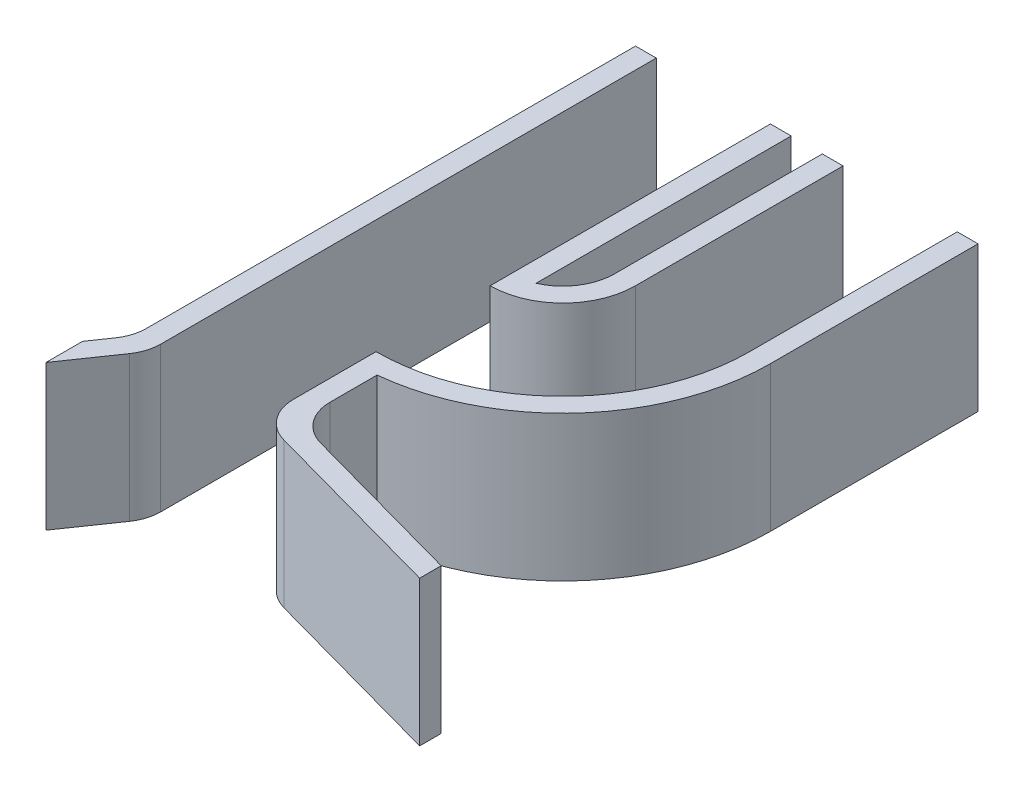
ISO-10303-21;
HEADER;
FILE_DESCRIPTION(('STEP AP214'),'2;1');
FILE_NAME('part.step','',(''),(''),'','','');
FILE_SCHEMA(('AUTOMOTIVE_DESIGN { 1 0 10303 214 1 1 1 1 }'));
ENDSEC;
DATA;
#1=APPLICATION_CONTEXT('core data for automotive mechanical design processes');
#2=APPLICATION_PROTOCOL_DEFINITION('international standard','automotive_design',2000,#1);
#3=PRODUCT_CONTEXT('',#1,'mechanical');
#4=PRODUCT('Part','Part','',(#3));
#5=PRODUCT_RELATED_PRODUCT_CATEGORY('part','',(#4));
#6=PRODUCT_DEFINITION_FORMATION('','',#4);
#7=PRODUCT_DEFINITION_CONTEXT('part definition',#1,'design');
#8=PRODUCT_DEFINITION('design','',#6,#7);
#9=PRODUCT_DEFINITION_SHAPE('','',#8);
#10=(LENGTH_UNIT() NAMED_UNIT(*) SI_UNIT(.MILLI.,.METRE.));
#11=(NAMED_UNIT(*) PLANE_ANGLE_UNIT() SI_UNIT($,.RADIAN.));
#12=(NAMED_UNIT(*) SI_UNIT($,.STERADIAN.) SOLID_ANGLE_UNIT());
#13=UNCERTAINTY_MEASURE_WITH_UNIT(LENGTH_MEASURE(1.E-05),#10,'distance_accuracy_value','');
#14=(GEOMETRIC_REPRESENTATION_CONTEXT(3) GLOBAL_UNCERTAINTY_ASSIGNED_CONTEXT((#13)) GLOBAL_UNIT_ASSIGNED_CONTEXT((#10,
#11,#12)) REPRESENTATION_CONTEXT('',''));
#15=CARTESIAN_POINT('',(0.,0.,0.));
#16=DIRECTION('',(0.,0.,1.));
#17=DIRECTION('',(1.,0.,0.));
#18=AXIS2_PLACEMENT_3D('',#15,#16,#17);
#19=CARTESIAN_POINT('',(0.,0.,0.));
#20=DIRECTION('',(0.,1.,0.));
#21=DIRECTION('',(0.,0.,1.));
#22=AXIS2_PLACEMENT_3D('',#19,#20,#21);
#23=PLANE('',#22);
#24=DIRECTION('',(-0.963911423189183,0.,-0.266223154976055));
#25=VECTOR('',#24,1.);
#26=CARTESIAN_POINT('',(1.94905612674862,0.,-7.05692735546926));
#27=LINE('',#26,#25);
#28=CARTESIAN_POINT('',(132.500000000002,0.,29.0000000000001));
#29=VERTEX_POINT('',#28);
#30=CARTESIAN_POINT('',(42.1755369004788,0.,4.05324352489411));
#31=VERTEX_POINT('',#30);
#32=EDGE_CURVE('E431',#29,#31,#27,.T.);
#33=ORIENTED_EDGE('',*,*,#32,.T.);
#34=CARTESIAN_POINT('',(47.4999999999999,0.,-15.2249849388895));
#35=DIRECTION('',(0.,1.,0.));
#36=DIRECTION('',(0.,0.,1.));
#37=AXIS2_PLACEMENT_3D('',#34,#35,#36);
#38=CIRCLE('',#37,20.);
#39=CARTESIAN_POINT('',(27.4999999999999,0.,-15.2249849388895));
#40=VERTEX_POINT('',#39);
#41=EDGE_CURVE('E322',#31,#40,#38,.F.);
#42=ORIENTED_EDGE('',*,*,#41,.T.);
#43=DIRECTION('',(0.,0.,-1.));
#44=VECTOR('',#43,1.);
#45=CARTESIAN_POINT('',(27.4999999999999,0.,0.));
#46=LINE('',#45,#44);
#47=CARTESIAN_POINT('',(27.4999999999999,0.,-55.));
#48=VERTEX_POINT('',#47);
#49=EDGE_CURVE('E391',#40,#48,#46,.T.);
#50=ORIENTED_EDGE('',*,*,#49,.T.);
#51=CARTESIAN_POINT('',(27.4999999999999,0.,-145.));
#52=DIRECTION('',(0.,1.,0.));
#53=DIRECTION('',(0.,0.,1.));
#54=AXIS2_PLACEMENT_3D('',#51,#52,#53);
#55=CIRCLE('',#54,89.9999999999999);
#56=CARTESIAN_POINT('',(117.5,0.,-145.));
#57=VERTEX_POINT('',#56);
#58=EDGE_CURVE('E386',#48,#57,#55,.T.);
#59=ORIENTED_EDGE('',*,*,#58,.T.);
#60=DIRECTION('',(0.,0.,-1.));
#61=VECTOR('',#60,1.);
#62=CARTESIAN_POINT('',(117.5,0.,0.));
#63=LINE('',#62,#61);
#64=CARTESIAN_POINT('',(117.5,0.,-245.));
#65=VERTEX_POINT('',#64);
#66=EDGE_CURVE('E390',#57,#65,#63,.T.);
#67=ORIENTED_EDGE('',*,*,#66,.T.);
#68=DIRECTION('',(-1.,0.,0.));
#69=VECTOR('',#68,1.);
#70=CARTESIAN_POINT('',(0.,0.,-245.));
#71=LINE('',#70,#69);
#72=CARTESIAN_POINT('',(127.5,0.,-245.));
#73=VERTEX_POINT('',#72);
#74=EDGE_CURVE('E411',#73,#65,#71,.T.);
#75=ORIENTED_EDGE('',*,*,#74,.F.);
#76=DIRECTION('',(0.,0.,-1.));
#77=VECTOR('',#76,1.);
#78=CARTESIAN_POINT('',(127.5,0.,0.));
#79=LINE('',#78,#77);
#80=CARTESIAN_POINT('',(127.5,0.,-145.));
#81=VERTEX_POINT('',#80);
#82=EDGE_CURVE('E414',#81,#73,#79,.T.);
#83=ORIENTED_EDGE('',*,*,#82,.F.);
#84=CARTESIAN_POINT('',(27.4999999999999,0.,-145.));
#85=DIRECTION('',(0.,1.,0.));
#86=DIRECTION('',(0.,0.,1.));
#87=AXIS2_PLACEMENT_3D('',#84,#85,#86);
#88=CIRCLE('',#87,99.9999999999999);
#89=CARTESIAN_POINT('',(37.4999999999999,0.,-45.501256289338));
#90=VERTEX_POINT('',#89);
#91=EDGE_CURVE('E421',#90,#81,#88,.T.);
#92=ORIENTED_EDGE('',*,*,#91,.F.);
#93=DIRECTION('',(0.,0.,1.));
#94=VECTOR('',#93,1.);
#95=CARTESIAN_POINT('',(37.4999999999999,0.,0.));
#96=LINE('',#95,#94);
#97=CARTESIAN_POINT('',(37.4999999999999,0.,-22.8374774083343));
#98=VERTEX_POINT('',#97);
#99=EDGE_CURVE('E423',#90,#98,#96,.T.);
#100=ORIENTED_EDGE('',*,*,#99,.T.);
#101=CARTESIAN_POINT('',(57.4999999999999,0.,-22.8374774083343));
#102=DIRECTION('',(0.,1.,0.));
#103=DIRECTION('',(0.,0.,1.));
#104=AXIS2_PLACEMENT_3D('',#101,#102,#103);
#105=CIRCLE('',#104,20.);
#106=CARTESIAN_POINT('',(52.1755369004788,0.,-3.55924894455067));
#107=VERTEX_POINT('',#106);
#108=EDGE_CURVE('E307',#98,#107,#105,.T.);
#109=ORIENTED_EDGE('',*,*,#108,.T.);
#110=DIRECTION('',(0.963911423189183,0.,0.266223154976055));
#111=VECTOR('',#110,1.);
#112=CARTESIAN_POINT('',(4.61128767650917,0.,-16.6960415873611));
#113=LINE('',#112,#111);
#114=CARTESIAN_POINT('',(132.500000000002,0.,18.6256027686506));
#115=VERTEX_POINT('',#114);
#116=EDGE_CURVE('E426',#107,#115,#113,.T.);
#117=ORIENTED_EDGE('',*,*,#116,.T.);
#118=DIRECTION('',(0.,0.,1.));
#119=VECTOR('',#118,1.);
#120=CARTESIAN_POINT('',(132.500000000002,0.,0.));
#121=LINE('',#120,#119);
#122=EDGE_CURVE('E428',#115,#29,#121,.T.);
#123=ORIENTED_EDGE('',*,*,#122,.T.);
#124=EDGE_LOOP('',(#33,#42,#50,#59,#67,#75,#83,#92,#100,#109,#117,#123));
#125=FACE_BOUND('',#124,.T.);
#126=ADVANCED_FACE('F299',(#125),#23,.F.);
#127=CARTESIAN_POINT('',(27.4999999999999,70.,-145.));
#128=DIRECTION('',(0.,-1.,0.));
#129=DIRECTION('',(0.,0.,-1.));
#130=AXIS2_PLACEMENT_3D('',#127,#128,#129);
#131=CYLINDRICAL_SURFACE('',#130,89.9999999999999);
#132=DIRECTION('',(0.,-1.,0.));
#133=VECTOR('',#132,1.);
#134=CARTESIAN_POINT('',(117.5,70.,-145.));
#135=LINE('',#134,#133);
#136=CARTESIAN_POINT('',(117.5,70.,-145.));
#137=VERTEX_POINT('',#136);
#138=EDGE_CURVE('E399',#137,#57,#135,.T.);
#139=ORIENTED_EDGE('',*,*,#138,.T.);
#140=ORIENTED_EDGE('',*,*,#58,.F.);
#141=DIRECTION('',(0.,-1.,0.));
#142=VECTOR('',#141,1.);
#143=CARTESIAN_POINT('',(27.4999999999999,70.,-55.));
#144=LINE('',#143,#142);
#145=CARTESIAN_POINT('',(27.4999999999999,70.,-55.));
#146=VERTEX_POINT('',#145);
#147=EDGE_CURVE('E504',#146,#48,#144,.T.);
#148=ORIENTED_EDGE('',*,*,#147,.F.);
#149=CARTESIAN_POINT('',(27.4999999999999,70.,-145.));
#150=DIRECTION('',(0.,1.,0.));
#151=DIRECTION('',(0.,0.,1.));
#152=AXIS2_PLACEMENT_3D('',#149,#150,#151);
#153=CIRCLE('',#152,89.9999999999999);
#154=EDGE_CURVE('E396',#146,#137,#153,.T.);
#155=ORIENTED_EDGE('',*,*,#154,.T.);
#156=EDGE_LOOP('',(#139,#140,#148,#155));
#157=FACE_BOUND('',#156,.T.);
#158=ADVANCED_FACE('F400',(#157),#131,.F.);
#159=CARTESIAN_POINT('',(27.4999999999999,70.,-145.));
#160=DIRECTION('',(0.,-1.,0.));
#161=DIRECTION('',(0.,0.,-1.));
#162=AXIS2_PLACEMENT_3D('',#159,#160,#161);
#163=CYLINDRICAL_SURFACE('',#162,99.9999999999999);
#164=ORIENTED_EDGE('',*,*,#91,.T.);
#165=DIRECTION('',(0.,-1.,0.));
#166=VECTOR('',#165,1.);
#167=CARTESIAN_POINT('',(127.5,70.,-145.));
#168=LINE('',#167,#166);
#169=CARTESIAN_POINT('',(127.5,70.,-145.));
#170=VERTEX_POINT('',#169);
#171=EDGE_CURVE('E485',#170,#81,#168,.T.);
#172=ORIENTED_EDGE('',*,*,#171,.F.);
#173=CARTESIAN_POINT('',(27.4999999999999,70.,-145.));
#174=DIRECTION('',(0.,1.,0.));
#175=DIRECTION('',(0.,0.,1.));
#176=AXIS2_PLACEMENT_3D('',#173,#174,#175);
#177=CIRCLE('',#176,99.9999999999999);
#178=CARTESIAN_POINT('',(37.4999999999999,70.,-45.501256289338));
#179=VERTEX_POINT('',#178);
#180=EDGE_CURVE('E439',#179,#170,#177,.T.);
#181=ORIENTED_EDGE('',*,*,#180,.F.);
#182=DIRECTION('',(0.,-1.,0.));
#183=VECTOR('',#182,1.);
#184=CARTESIAN_POINT('',(37.4999999999999,70.,-45.501256289338));
#185=LINE('',#184,#183);
#186=EDGE_CURVE('E482',#179,#90,#185,.T.);
#187=ORIENTED_EDGE('',*,*,#186,.T.);
#188=EDGE_LOOP('',(#164,#172,#181,#187));
#189=FACE_BOUND('',#188,.T.);
#190=ADVANCED_FACE('F488',(#189),#163,.T.);
#191=CARTESIAN_POINT('',(127.5,70.,0.));
#192=DIRECTION('',(-1.,0.,0.));
#193=DIRECTION('',(0.,0.,1.));
#194=AXIS2_PLACEMENT_3D('',#191,#192,#193);
#195=PLANE('',#194);
#196=ORIENTED_EDGE('',*,*,#82,.T.);
#197=DIRECTION('',(0.,-1.,0.));
#198=VECTOR('',#197,1.);
#199=CARTESIAN_POINT('',(127.5,70.,-245.));
#200=LINE('',#199,#198);
#201=CARTESIAN_POINT('',(127.5,70.,-245.));
#202=VERTEX_POINT('',#201);
#203=EDGE_CURVE('E495',#202,#73,#200,.T.);
#204=ORIENTED_EDGE('',*,*,#203,.F.);
#205=DIRECTION('',(0.,0.,-1.));
#206=VECTOR('',#205,1.);
#207=CARTESIAN_POINT('',(127.5,70.,0.));
#208=LINE('',#207,#206);
#209=EDGE_CURVE('E437',#170,#202,#208,.T.);
#210=ORIENTED_EDGE('',*,*,#209,.F.);
#211=ORIENTED_EDGE('',*,*,#171,.T.);
#212=EDGE_LOOP('',(#196,#204,#210,#211));
#213=FACE_BOUND('',#212,.T.);
#214=ADVANCED_FACE('F496',(#213),#195,.F.);
#215=CARTESIAN_POINT('',(0.,70.,-245.));
#216=DIRECTION('',(0.,0.,1.));
#217=DIRECTION('',(1.,0.,0.));
#218=AXIS2_PLACEMENT_3D('',#215,#216,#217);
#219=PLANE('',#218);
#220=ORIENTED_EDGE('',*,*,#74,.T.);
#221=DIRECTION('',(0.,-1.,0.));
#222=VECTOR('',#221,1.);
#223=CARTESIAN_POINT('',(117.5,70.,-245.));
#224=LINE('',#223,#222);
#225=CARTESIAN_POINT('',(117.5,70.,-245.));
#226=VERTEX_POINT('',#225);
#227=EDGE_CURVE('E406',#226,#65,#224,.T.);
#228=ORIENTED_EDGE('',*,*,#227,.F.);
#229=DIRECTION('',(-1.,0.,0.));
#230=VECTOR('',#229,1.);
#231=CARTESIAN_POINT('',(0.,70.,-245.));
#232=LINE('',#231,#230);
#233=EDGE_CURVE('E435',#202,#226,#232,.T.);
#234=ORIENTED_EDGE('',*,*,#233,.F.);
#235=ORIENTED_EDGE('',*,*,#203,.T.);
#236=EDGE_LOOP('',(#220,#228,#234,#235));
#237=FACE_BOUND('',#236,.T.);
#238=ADVANCED_FACE('F500',(#237),#219,.F.);
#239=CARTESIAN_POINT('',(117.5,70.,0.));
#240=DIRECTION('',(-1.,0.,0.));
#241=DIRECTION('',(0.,0.,1.));
#242=AXIS2_PLACEMENT_3D('',#239,#240,#241);
#243=PLANE('',#242);
#244=ORIENTED_EDGE('',*,*,#66,.F.);
#245=ORIENTED_EDGE('',*,*,#138,.F.);
#246=DIRECTION('',(0.,0.,-1.));
#247=VECTOR('',#246,1.);
#248=CARTESIAN_POINT('',(117.5,70.,0.));
#249=LINE('',#248,#247);
#250=EDGE_CURVE('E405',#137,#226,#249,.T.);
#251=ORIENTED_EDGE('',*,*,#250,.T.);
#252=ORIENTED_EDGE('',*,*,#227,.T.);
#253=EDGE_LOOP('',(#244,#245,#251,#252));
#254=FACE_BOUND('',#253,.T.);
#255=ADVANCED_FACE('F408',(#254),#243,.T.);
#256=CARTESIAN_POINT('',(27.4999999999999,70.,0.));
#257=DIRECTION('',(-1.,0.,0.));
#258=DIRECTION('',(0.,0.,1.));
#259=AXIS2_PLACEMENT_3D('',#256,#257,#258);
#260=PLANE('',#259);
#261=ORIENTED_EDGE('',*,*,#49,.F.);
#262=DIRECTION('',(0.,-1.,0.));
#263=VECTOR('',#262,1.);
#264=CARTESIAN_POINT('',(27.4999999999999,70.,-15.2249849388895));
#265=LINE('',#264,#263);
#266=CARTESIAN_POINT('',(27.4999999999999,70.,-15.2249849388895));
#267=VERTEX_POINT('',#266);
#268=EDGE_CURVE('E314',#40,#267,#265,.F.);
#269=ORIENTED_EDGE('',*,*,#268,.T.);
#270=DIRECTION('',(0.,0.,-1.));
#271=VECTOR('',#270,1.);
#272=CARTESIAN_POINT('',(27.4999999999999,70.,0.));
#273=LINE('',#272,#271);
#274=EDGE_CURVE('E412',#267,#146,#273,.T.);
#275=ORIENTED_EDGE('',*,*,#274,.T.);
#276=ORIENTED_EDGE('',*,*,#147,.T.);
#277=EDGE_LOOP('',(#261,#269,#275,#276));
#278=FACE_BOUND('',#277,.T.);
#279=ADVANCED_FACE('F546',(#278),#260,.T.);
#280=CARTESIAN_POINT('',(1.94905612674862,70.,-7.05692735546926));
#281=DIRECTION('',(-0.266223154976055,0.,0.963911423189182));
#282=DIRECTION('',(0.963911423189182,0.,0.266223154976055));
#283=AXIS2_PLACEMENT_3D('',#280,#281,#282);
#284=PLANE('',#283);
#285=DIRECTION('',(-0.963911423189183,0.,-0.266223154976055));
#286=VECTOR('',#285,1.);
#287=CARTESIAN_POINT('',(1.94905612674862,70.,-7.05692735546926));
#288=LINE('',#287,#286);
#289=CARTESIAN_POINT('',(132.500000000002,70.,29.0000000000001));
#290=VERTEX_POINT('',#289);
#291=CARTESIAN_POINT('',(42.1755369004788,70.,4.05324352489411));
#292=VERTEX_POINT('',#291);
#293=EDGE_CURVE('E416',#290,#292,#288,.T.);
#294=ORIENTED_EDGE('',*,*,#293,.T.);
#295=DIRECTION('',(0.,-1.,0.));
#296=VECTOR('',#295,1.);
#297=CARTESIAN_POINT('',(42.1755369004787,70.,4.05324352489411));
#298=LINE('',#297,#296);
#299=EDGE_CURVE('E455',#292,#31,#298,.T.);
#300=ORIENTED_EDGE('',*,*,#299,.T.);
#301=ORIENTED_EDGE('',*,*,#32,.F.);
#302=DIRECTION('',(0.,-1.,0.));
#303=VECTOR('',#302,1.);
#304=CARTESIAN_POINT('',(132.500000000002,70.,29.0000000000001));
#305=LINE('',#304,#303);
#306=EDGE_CURVE('E506',#290,#29,#305,.T.);
#307=ORIENTED_EDGE('',*,*,#306,.F.);
#308=EDGE_LOOP('',(#294,#300,#301,#307));
#309=FACE_BOUND('',#308,.T.);
#310=ADVANCED_FACE('F514',(#309),#284,.T.);
#311=CARTESIAN_POINT('',(132.500000000002,70.,0.));
#312=DIRECTION('',(1.,0.,0.));
#313=DIRECTION('',(0.,0.,-1.));
#314=AXIS2_PLACEMENT_3D('',#311,#312,#313);
#315=PLANE('',#314);
#316=ORIENTED_EDGE('',*,*,#122,.F.);
#317=DIRECTION('',(0.,-1.,0.));
#318=VECTOR('',#317,1.);
#319=CARTESIAN_POINT('',(132.500000000002,70.,18.6256027686506));
#320=LINE('',#319,#318);
#321=CARTESIAN_POINT('',(132.500000000002,70.,18.6256027686506));
#322=VERTEX_POINT('',#321);
#323=EDGE_CURVE('E472',#322,#115,#320,.T.);
#324=ORIENTED_EDGE('',*,*,#323,.F.);
#325=DIRECTION('',(0.,0.,1.));
#326=VECTOR('',#325,1.);
#327=CARTESIAN_POINT('',(132.500000000002,70.,0.));
#328=LINE('',#327,#326);
#329=EDGE_CURVE('E446',#322,#290,#328,.T.);
#330=ORIENTED_EDGE('',*,*,#329,.T.);
#331=ORIENTED_EDGE('',*,*,#306,.T.);
#332=EDGE_LOOP('',(#316,#324,#330,#331));
#333=FACE_BOUND('',#332,.T.);
#334=ADVANCED_FACE('F511',(#333),#315,.T.);
#335=CARTESIAN_POINT('',(4.61128767650917,70.,-16.6960415873611));
#336=DIRECTION('',(0.266223154976055,0.,-0.963911423189182));
#337=DIRECTION('',(-0.963911423189183,0.,-0.266223154976055));
#338=AXIS2_PLACEMENT_3D('',#335,#336,#337);
#339=PLANE('',#338);
#340=ORIENTED_EDGE('',*,*,#116,.F.);
#341=DIRECTION('',(0.,-1.,0.));
#342=VECTOR('',#341,1.);
#343=CARTESIAN_POINT('',(52.1755369004788,70.,-3.55924894455067));
#344=LINE('',#343,#342);
#345=CARTESIAN_POINT('',(52.1755369004788,70.,-3.55924894455067));
#346=VERTEX_POINT('',#345);
#347=EDGE_CURVE('E453',#107,#346,#344,.F.);
#348=ORIENTED_EDGE('',*,*,#347,.T.);
#349=DIRECTION('',(0.963911423189183,0.,0.266223154976055));
#350=VECTOR('',#349,1.);
#351=CARTESIAN_POINT('',(4.61128767650917,70.,-16.6960415873611));
#352=LINE('',#351,#350);
#353=EDGE_CURVE('E444',#346,#322,#352,.T.);
#354=ORIENTED_EDGE('',*,*,#353,.T.);
#355=ORIENTED_EDGE('',*,*,#323,.T.);
#356=EDGE_LOOP('',(#340,#348,#354,#355));
#357=FACE_BOUND('',#356,.T.);
#358=ADVANCED_FACE('F469',(#357),#339,.T.);
#359=CARTESIAN_POINT('',(37.4999999999999,70.,0.));
#360=DIRECTION('',(1.,0.,0.));
#361=DIRECTION('',(0.,0.,-1.));
#362=AXIS2_PLACEMENT_3D('',#359,#360,#361);
#363=PLANE('',#362);
#364=DIRECTION('',(0.,0.,1.));
#365=VECTOR('',#364,1.);
#366=CARTESIAN_POINT('',(37.4999999999999,70.,0.));
#367=LINE('',#366,#365);
#368=CARTESIAN_POINT('',(37.4999999999999,70.,-22.8374774083343));
#369=VERTEX_POINT('',#368);
#370=EDGE_CURVE('E441',#179,#369,#367,.T.);
#371=ORIENTED_EDGE('',*,*,#370,.T.);
#372=DIRECTION('',(0.,-1.,0.));
#373=VECTOR('',#372,1.);
#374=CARTESIAN_POINT('',(37.4999999999999,0.,-22.8374774083343));
#375=LINE('',#374,#373);
#376=EDGE_CURVE('E395',#369,#98,#375,.T.);
#377=ORIENTED_EDGE('',*,*,#376,.T.);
#378=ORIENTED_EDGE('',*,*,#99,.F.);
#379=ORIENTED_EDGE('',*,*,#186,.F.);
#380=EDGE_LOOP('',(#371,#377,#378,#379));
#381=FACE_BOUND('',#380,.T.);
#382=ADVANCED_FACE('F481',(#381),#363,.T.);
#383=CARTESIAN_POINT('',(0.,70.,0.));
#384=DIRECTION('',(0.,1.,0.));
#385=DIRECTION('',(0.,0.,1.));
#386=AXIS2_PLACEMENT_3D('',#383,#384,#385);
#387=PLANE('',#386);
#388=ORIENTED_EDGE('',*,*,#274,.F.);
#389=CARTESIAN_POINT('',(47.4999999999999,70.,-15.2249849388895));
#390=DIRECTION('',(0.,1.,0.));
#391=DIRECTION('',(0.,0.,1.));
#392=AXIS2_PLACEMENT_3D('',#389,#390,#391);
#393=CIRCLE('',#392,20.);
#394=EDGE_CURVE('E460',#267,#292,#393,.T.);
#395=ORIENTED_EDGE('',*,*,#394,.T.);
#396=ORIENTED_EDGE('',*,*,#293,.F.);
#397=ORIENTED_EDGE('',*,*,#329,.F.);
#398=ORIENTED_EDGE('',*,*,#353,.F.);
#399=CARTESIAN_POINT('',(57.4999999999999,70.,-22.8374774083343));
#400=DIRECTION('',(0.,1.,0.));
#401=DIRECTION('',(0.,0.,1.));
#402=AXIS2_PLACEMENT_3D('',#399,#400,#401);
#403=CIRCLE('',#402,20.);
#404=EDGE_CURVE('E13',#346,#369,#403,.F.);
#405=ORIENTED_EDGE('',*,*,#404,.T.);
#406=ORIENTED_EDGE('',*,*,#370,.F.);
#407=ORIENTED_EDGE('',*,*,#180,.T.);
#408=ORIENTED_EDGE('',*,*,#209,.T.);
#409=ORIENTED_EDGE('',*,*,#233,.T.);
#410=ORIENTED_EDGE('',*,*,#250,.F.);
#411=ORIENTED_EDGE('',*,*,#154,.F.);
#412=EDGE_LOOP('',(#388,#395,#396,#397,#398,#405,#406,#407,#408,#409,#410,#411));
#413=FACE_BOUND('',#412,.T.);
#414=ADVANCED_FACE('F478',(#413),#387,.T.);
#415=CARTESIAN_POINT('',(57.4999999999999,70.,-22.8374774083343));
#416=DIRECTION('',(0.,1.,0.));
#417=DIRECTION('',(0.,0.,1.));
#418=AXIS2_PLACEMENT_3D('',#415,#416,#417);
#419=CYLINDRICAL_SURFACE('',#418,20.);
#420=ORIENTED_EDGE('',*,*,#404,.F.);
#421=ORIENTED_EDGE('',*,*,#347,.F.);
#422=ORIENTED_EDGE('',*,*,#108,.F.);
#423=ORIENTED_EDGE('',*,*,#376,.F.);
#424=EDGE_LOOP('',(#420,#421,#422,#423));
#425=FACE_BOUND('',#424,.T.);
#426=ADVANCED_FACE('F475',(#425),#419,.F.);
#427=CARTESIAN_POINT('',(47.4999999999999,70.,-15.2249849388895));
#428=DIRECTION('',(0.,-1.,0.));
#429=DIRECTION('',(0.,0.,-1.));
#430=AXIS2_PLACEMENT_3D('',#427,#428,#429);
#431=CYLINDRICAL_SURFACE('',#430,20.);
#432=ORIENTED_EDGE('',*,*,#394,.F.);
#433=ORIENTED_EDGE('',*,*,#268,.F.);
#434=ORIENTED_EDGE('',*,*,#41,.F.);
#435=ORIENTED_EDGE('',*,*,#299,.F.);
#436=EDGE_LOOP('',(#432,#433,#434,#435));
#437=FACE_BOUND('',#436,.T.);
#438=ADVANCED_FACE('F301',(#437),#431,.T.);
#439=CLOSED_SHELL('',(#126,#158,#190,#214,#238,#255,#279,#310,#334,#358,#382,#414,#426,#438));
#440=MANIFOLD_SOLID_BREP('B2',#439);
#441=CARTESIAN_POINT('',(-27.4999999999999,70.,0.));
#442=DIRECTION('',(-1.,0.,0.));
#443=DIRECTION('',(0.,0.,1.));
#444=AXIS2_PLACEMENT_3D('',#441,#442,#443);
#445=PLANE('',#444);
#446=DIRECTION('',(0.,0.,-1.));
#447=VECTOR('',#446,1.);
#448=CARTESIAN_POINT('',(-27.4999999999999,70.,0.));
#449=LINE('',#448,#447);
#450=CARTESIAN_POINT('',(-27.4999999999999,70.,-6.22782990761662));
#451=VERTEX_POINT('',#450);
#452=CARTESIAN_POINT('',(-27.4999999999999,70.,-245.));
#453=VERTEX_POINT('',#452);
#454=EDGE_CURVE('E797',#451,#453,#449,.T.);
#455=ORIENTED_EDGE('',*,*,#454,.F.);
#456=DIRECTION('',(0.,-1.,0.));
#457=VECTOR('',#456,1.);
#458=CARTESIAN_POINT('',(-27.4999999999999,70.,-6.22782990761662));
#459=LINE('',#458,#457);
#460=CARTESIAN_POINT('',(-27.4999999999999,0.,-6.22782990761662));
#461=VERTEX_POINT('',#460);
#462=EDGE_CURVE('E825',#451,#461,#459,.T.);
#463=ORIENTED_EDGE('',*,*,#462,.T.);
#464=DIRECTION('',(0.,0.,-1.));
#465=VECTOR('',#464,1.);
#466=CARTESIAN_POINT('',(-27.4999999999999,0.,0.));
#467=LINE('',#466,#465);
#468=CARTESIAN_POINT('',(-27.4999999999999,0.,-245.));
#469=VERTEX_POINT('',#468);
#470=EDGE_CURVE('E809',#461,#469,#467,.T.);
#471=ORIENTED_EDGE('',*,*,#470,.T.);
#472=DIRECTION('',(0.,-1.,0.));
#473=VECTOR('',#472,1.);
#474=CARTESIAN_POINT('',(-27.4999999999999,70.,-245.));
#475=LINE('',#474,#473);
#476=EDGE_CURVE('E858',#453,#469,#475,.T.);
#477=ORIENTED_EDGE('',*,*,#476,.F.);
#478=EDGE_LOOP('',(#455,#463,#471,#477));
#479=FACE_BOUND('',#478,.T.);
#480=ADVANCED_FACE('F715',(#479),#445,.F.);
#481=CARTESIAN_POINT('',(-27.4999999999999,70.,-245.));
#482=DIRECTION('',(0.,0.,1.));
#483=DIRECTION('',(1.,0.,0.));
#484=AXIS2_PLACEMENT_3D('',#481,#482,#483);
#485=PLANE('',#484);
#486=DIRECTION('',(-1.,0.,0.));
#487=VECTOR('',#486,1.);
#488=CARTESIAN_POINT('',(-27.4999999999999,0.,-245.));
#489=LINE('',#488,#487);
#490=CARTESIAN_POINT('',(-37.4999999999999,0.,-245.));
#491=VERTEX_POINT('',#490);
#492=EDGE_CURVE('E807',#469,#491,#489,.T.);
#493=ORIENTED_EDGE('',*,*,#492,.T.);
#494=DIRECTION('',(0.,-1.,0.));
#495=VECTOR('',#494,1.);
#496=CARTESIAN_POINT('',(-37.4999999999999,70.,-245.));
#497=LINE('',#496,#495);
#498=CARTESIAN_POINT('',(-37.4999999999999,70.,-245.));
#499=VERTEX_POINT('',#498);
#500=EDGE_CURVE('E841',#499,#491,#497,.T.);
#501=ORIENTED_EDGE('',*,*,#500,.F.);
#502=DIRECTION('',(-1.,0.,0.));
#503=VECTOR('',#502,1.);
#504=CARTESIAN_POINT('',(-27.4999999999999,70.,-245.));
#505=LINE('',#504,#503);
#506=EDGE_CURVE('E799',#453,#499,#505,.T.);
#507=ORIENTED_EDGE('',*,*,#506,.F.);
#508=ORIENTED_EDGE('',*,*,#476,.T.);
#509=EDGE_LOOP('',(#493,#501,#507,#508));
#510=FACE_BOUND('',#509,.T.);
#511=ADVANCED_FACE('F859',(#510),#485,.F.);
#512=CARTESIAN_POINT('',(-37.4999999999999,70.,-245.));
#513=DIRECTION('',(1.,0.,0.));
#514=DIRECTION('',(0.,0.,-1.));
#515=AXIS2_PLACEMENT_3D('',#512,#513,#514);
#516=PLANE('',#515);
#517=DIRECTION('',(0.,0.,1.));
#518=VECTOR('',#517,1.);
#519=CARTESIAN_POINT('',(-37.4999999999999,0.,-245.));
#520=LINE('',#519,#518);
#521=CARTESIAN_POINT('',(-37.4999999999999,0.,-9.34174486142483));
#522=VERTEX_POINT('',#521);
#523=EDGE_CURVE('E804',#491,#522,#520,.T.);
#524=ORIENTED_EDGE('',*,*,#523,.T.);
#525=DIRECTION('',(0.,-1.,0.));
#526=VECTOR('',#525,1.);
#527=CARTESIAN_POINT('',(-37.4999999999999,70.,-9.34174486142484));
#528=LINE('',#527,#526);
#529=CARTESIAN_POINT('',(-37.4999999999999,70.,-9.34174486142483));
#530=VERTEX_POINT('',#529);
#531=EDGE_CURVE('E823',#522,#530,#528,.F.);
#532=ORIENTED_EDGE('',*,*,#531,.T.);
#533=DIRECTION('',(0.,0.,1.));
#534=VECTOR('',#533,1.);
#535=CARTESIAN_POINT('',(-37.4999999999999,70.,-245.));
#536=LINE('',#535,#534);
#537=EDGE_CURVE('E817',#499,#530,#536,.T.);
#538=ORIENTED_EDGE('',*,*,#537,.F.);
#539=ORIENTED_EDGE('',*,*,#500,.T.);
#540=EDGE_LOOP('',(#524,#532,#538,#539));
#541=FACE_BOUND('',#540,.T.);
#542=ADVANCED_FACE('F838',(#541),#516,.F.);
#543=CARTESIAN_POINT('',(-37.4999999999999,70.,-3.11391495380824));
#544=DIRECTION('',(0.82321278591533,0.,0.567732955803625));
#545=DIRECTION('',(0.567732955803625,0.,-0.823212785915331));
#546=AXIS2_PLACEMENT_3D('',#543,#544,#545);
#547=PLANE('',#546);
#548=DIRECTION('',(-0.567732955803625,0.,0.82321278591533));
#549=VECTOR('',#548,1.);
#550=CARTESIAN_POINT('',(-37.4999999999999,70.,-3.11391495380824));
#551=LINE('',#550,#549);
#552=CARTESIAN_POINT('',(-41.0357442816933,70.,2.01291425464765));
#553=VERTEX_POINT('',#552);
#554=CARTESIAN_POINT('',(-47.4999999999981,70.,11.3860850461905));
#555=VERTEX_POINT('',#554);
#556=EDGE_CURVE('E815',#553,#555,#551,.T.);
#557=ORIENTED_EDGE('',*,*,#556,.F.);
#558=DIRECTION('',(0.,-1.,0.));
#559=VECTOR('',#558,1.);
#560=CARTESIAN_POINT('',(-41.0357442816933,0.,2.01291425464765));
#561=LINE('',#560,#559);
#562=CARTESIAN_POINT('',(-41.0357442816933,0.,2.01291425464765));
#563=VERTEX_POINT('',#562);
#564=EDGE_CURVE('E811',#553,#563,#561,.T.);
#565=ORIENTED_EDGE('',*,*,#564,.T.);
#566=DIRECTION('',(-0.567732955803625,0.,0.82321278591533));
#567=VECTOR('',#566,1.);
#568=CARTESIAN_POINT('',(-37.4999999999999,0.,-3.11391495380824));
#569=LINE('',#568,#567);
#570=CARTESIAN_POINT('',(-47.4999999999981,0.,11.3860850461905));
#571=VERTEX_POINT('',#570);
#572=EDGE_CURVE('E790',#563,#571,#569,.T.);
#573=ORIENTED_EDGE('',*,*,#572,.T.);
#574=DIRECTION('',(0.,-1.,0.));
#575=VECTOR('',#574,1.);
#576=CARTESIAN_POINT('',(-47.4999999999981,70.,11.3860850461905));
#577=LINE('',#576,#575);
#578=EDGE_CURVE('E788',#555,#571,#577,.T.);
#579=ORIENTED_EDGE('',*,*,#578,.F.);
#580=EDGE_LOOP('',(#557,#565,#573,#579));
#581=FACE_BOUND('',#580,.T.);
#582=ADVANCED_FACE('F848',(#581),#547,.F.);
#583=CARTESIAN_POINT('',(-47.4999999999981,70.,11.3860850461905));
#584=DIRECTION('',(1.,0.,0.));
#585=DIRECTION('',(0.,0.,-1.));
#586=AXIS2_PLACEMENT_3D('',#583,#584,#585);
#587=PLANE('',#586);
#588=DIRECTION('',(0.,0.,1.));
#589=VECTOR('',#588,1.);
#590=CARTESIAN_POINT('',(-47.4999999999981,0.,11.3860850461905));
#591=LINE('',#590,#589);
#592=CARTESIAN_POINT('',(-47.4999999999981,0.,29.0000000000001));
#593=VERTEX_POINT('',#592);
#594=EDGE_CURVE('E782',#571,#593,#591,.T.);
#595=ORIENTED_EDGE('',*,*,#594,.T.);
#596=DIRECTION('',(0.,-1.,0.));
#597=VECTOR('',#596,1.);
#598=CARTESIAN_POINT('',(-47.4999999999981,70.,29.0000000000001));
#599=LINE('',#598,#597);
#600=CARTESIAN_POINT('',(-47.4999999999981,70.,29.0000000000001));
#601=VERTEX_POINT('',#600);
#602=EDGE_CURVE('E786',#601,#593,#599,.T.);
#603=ORIENTED_EDGE('',*,*,#602,.F.);
#604=DIRECTION('',(0.,0.,1.));
#605=VECTOR('',#604,1.);
#606=CARTESIAN_POINT('',(-47.4999999999981,70.,11.3860850461905));
#607=LINE('',#606,#605);
#608=EDGE_CURVE('E813',#555,#601,#607,.T.);
#609=ORIENTED_EDGE('',*,*,#608,.F.);
#610=ORIENTED_EDGE('',*,*,#578,.T.);
#611=EDGE_LOOP('',(#595,#603,#609,#610));
#612=FACE_BOUND('',#611,.T.);
#613=ADVANCED_FACE('F784',(#612),#587,.F.);
#614=CARTESIAN_POINT('',(-47.4999999999981,70.,29.0000000000001));
#615=DIRECTION('',(-0.823212785915331,0.,-0.567732955803624));
#616=DIRECTION('',(-0.567732955803624,0.,0.823212785915331));
#617=AXIS2_PLACEMENT_3D('',#614,#615,#616);
#618=PLANE('',#617);
#619=DIRECTION('',(0.567732955803624,0.,-0.823212785915331));
#620=VECTOR('',#619,1.);
#621=CARTESIAN_POINT('',(-47.4999999999981,0.,29.0000000000001));
#622=LINE('',#621,#620);
#623=CARTESIAN_POINT('',(-31.0357442816933,0.,5.12682920845588));
#624=VERTEX_POINT('',#623);
#625=EDGE_CURVE('E791',#593,#624,#622,.T.);
#626=ORIENTED_EDGE('',*,*,#625,.T.);
#627=DIRECTION('',(0.,-1.,0.));
#628=VECTOR('',#627,1.);
#629=CARTESIAN_POINT('',(-31.0357442816933,70.,5.12682920845588));
#630=LINE('',#629,#628);
#631=CARTESIAN_POINT('',(-31.0357442816933,70.,5.12682920845588));
#632=VERTEX_POINT('',#631);
#633=EDGE_CURVE('E730',#624,#632,#630,.F.);
#634=ORIENTED_EDGE('',*,*,#633,.T.);
#635=DIRECTION('',(0.567732955803624,0.,-0.823212785915331));
#636=VECTOR('',#635,1.);
#637=CARTESIAN_POINT('',(-47.4999999999981,70.,29.0000000000001));
#638=LINE('',#637,#636);
#639=EDGE_CURVE('E794',#601,#632,#638,.T.);
#640=ORIENTED_EDGE('',*,*,#639,.F.);
#641=ORIENTED_EDGE('',*,*,#602,.T.);
#642=EDGE_LOOP('',(#626,#634,#640,#641));
#643=FACE_BOUND('',#642,.T.);
#644=ADVANCED_FACE('F793',(#643),#618,.F.);
#645=CARTESIAN_POINT('',(0.,70.,0.));
#646=DIRECTION('',(0.,1.,0.));
#647=DIRECTION('',(0.,0.,1.));
#648=AXIS2_PLACEMENT_3D('',#645,#646,#647);
#649=PLANE('',#648);
#650=ORIENTED_EDGE('',*,*,#639,.T.);
#651=CARTESIAN_POINT('',(-47.4999999999999,70.,-6.22782990761661));
#652=DIRECTION('',(0.,1.,0.));
#653=DIRECTION('',(0.,0.,1.));
#654=AXIS2_PLACEMENT_3D('',#651,#652,#653);
#655=CIRCLE('',#654,20.);
#656=EDGE_CURVE('E830',#632,#451,#655,.T.);
#657=ORIENTED_EDGE('',*,*,#656,.T.);
#658=ORIENTED_EDGE('',*,*,#454,.T.);
#659=ORIENTED_EDGE('',*,*,#506,.T.);
#660=ORIENTED_EDGE('',*,*,#537,.T.);
#661=CARTESIAN_POINT('',(-57.4999999999999,70.,-9.34174486142484));
#662=DIRECTION('',(0.,1.,0.));
#663=DIRECTION('',(0.,0.,1.));
#664=AXIS2_PLACEMENT_3D('',#661,#662,#663);
#665=CIRCLE('',#664,20.);
#666=EDGE_CURVE('E297',#530,#553,#665,.F.);
#667=ORIENTED_EDGE('',*,*,#666,.T.);
#668=ORIENTED_EDGE('',*,*,#556,.T.);
#669=ORIENTED_EDGE('',*,*,#608,.T.);
#670=EDGE_LOOP('',(#650,#657,#658,#659,#660,#667,#668,#669));
#671=FACE_BOUND('',#670,.T.);
#672=ADVANCED_FACE('F846',(#671),#649,.T.);
#673=CARTESIAN_POINT('',(0.,0.,0.));
#674=DIRECTION('',(0.,1.,0.));
#675=DIRECTION('',(0.,0.,1.));
#676=AXIS2_PLACEMENT_3D('',#673,#674,#675);
#677=PLANE('',#676);
#678=ORIENTED_EDGE('',*,*,#470,.F.);
#679=CARTESIAN_POINT('',(-47.4999999999999,0.,-6.22782990761661));
#680=DIRECTION('',(0.,1.,0.));
#681=DIRECTION('',(0.,0.,1.));
#682=AXIS2_PLACEMENT_3D('',#679,#680,#681);
#683=CIRCLE('',#682,20.);
#684=EDGE_CURVE('E738',#461,#624,#683,.F.);
#685=ORIENTED_EDGE('',*,*,#684,.T.);
#686=ORIENTED_EDGE('',*,*,#625,.F.);
#687=ORIENTED_EDGE('',*,*,#594,.F.);
#688=ORIENTED_EDGE('',*,*,#572,.F.);
#689=CARTESIAN_POINT('',(-57.4999999999999,0.,-9.34174486142484));
#690=DIRECTION('',(0.,1.,0.));
#691=DIRECTION('',(0.,0.,1.));
#692=AXIS2_PLACEMENT_3D('',#689,#690,#691);
#693=CIRCLE('',#692,20.);
#694=EDGE_CURVE('E723',#563,#522,#693,.T.);
#695=ORIENTED_EDGE('',*,*,#694,.T.);
#696=ORIENTED_EDGE('',*,*,#523,.F.);
#697=ORIENTED_EDGE('',*,*,#492,.F.);
#698=EDGE_LOOP('',(#678,#685,#686,#687,#688,#695,#696,#697));
#699=FACE_BOUND('',#698,.T.);
#700=ADVANCED_FACE('F796',(#699),#677,.F.);
#701=CARTESIAN_POINT('',(-57.4999999999999,70.,-9.34174486142484));
#702=DIRECTION('',(0.,1.,0.));
#703=DIRECTION('',(0.,0.,1.));
#704=AXIS2_PLACEMENT_3D('',#701,#702,#703);
#705=CYLINDRICAL_SURFACE('',#704,20.);
#706=ORIENTED_EDGE('',*,*,#666,.F.);
#707=ORIENTED_EDGE('',*,*,#531,.F.);
#708=ORIENTED_EDGE('',*,*,#694,.F.);
#709=ORIENTED_EDGE('',*,*,#564,.F.);
#710=EDGE_LOOP('',(#706,#707,#708,#709));
#711=FACE_BOUND('',#710,.T.);
#712=ADVANCED_FACE('F843',(#711),#705,.F.);
#713=CARTESIAN_POINT('',(-47.4999999999999,70.,-6.22782990761661));
#714=DIRECTION('',(0.,-1.,0.));
#715=DIRECTION('',(0.,0.,-1.));
#716=AXIS2_PLACEMENT_3D('',#713,#714,#715);
#717=CYLINDRICAL_SURFACE('',#716,20.);
#718=ORIENTED_EDGE('',*,*,#656,.F.);
#719=ORIENTED_EDGE('',*,*,#633,.F.);
#720=ORIENTED_EDGE('',*,*,#684,.F.);
#721=ORIENTED_EDGE('',*,*,#462,.F.);
#722=EDGE_LOOP('',(#718,#719,#720,#721));
#723=FACE_BOUND('',#722,.T.);
#724=ADVANCED_FACE('F717',(#723),#717,.T.);
#725=CLOSED_SHELL('',(#480,#511,#542,#582,#613,#644,#672,#700,#712,#724));
#726=MANIFOLD_SOLID_BREP('B7',#725);
#727=CARTESIAN_POINT('',(27.4999999999999,70.,0.));
#728=DIRECTION('',(-1.,0.,0.));
#729=DIRECTION('',(0.,0.,1.));
#730=AXIS2_PLACEMENT_3D('',#727,#728,#729);
#731=PLANE('',#730);
#732=DIRECTION('',(0.,0.,-1.));
#733=VECTOR('',#732,1.);
#734=CARTESIAN_POINT('',(27.4999999999999,0.,0.));
#735=LINE('',#734,#733);
#736=CARTESIAN_POINT('',(27.4999999999999,0.,-110.));
#737=VERTEX_POINT('',#736);
#738=CARTESIAN_POINT('',(27.4999999999999,0.,-245.));
#739=VERTEX_POINT('',#738);
#740=EDGE_CURVE('E1056',#737,#739,#735,.T.);
#741=ORIENTED_EDGE('',*,*,#740,.F.);
#742=DIRECTION('',(0.,-1.,0.));
#743=VECTOR('',#742,1.);
#744=CARTESIAN_POINT('',(27.4999999999999,70.,-110.));
#745=LINE('',#744,#743);
#746=CARTESIAN_POINT('',(27.4999999999999,70.,-110.));
#747=VERTEX_POINT('',#746);
#748=EDGE_CURVE('E713',#747,#737,#745,.T.);
#749=ORIENTED_EDGE('',*,*,#748,.F.);
#750=DIRECTION('',(0.,0.,-1.));
#751=VECTOR('',#750,1.);
#752=CARTESIAN_POINT('',(27.4999999999999,70.,0.));
#753=LINE('',#752,#751);
#754=CARTESIAN_POINT('',(27.4999999999999,70.,-245.));
#755=VERTEX_POINT('',#754);
#756=EDGE_CURVE('E1076',#747,#755,#753,.T.);
#757=ORIENTED_EDGE('',*,*,#756,.T.);
#758=DIRECTION('',(0.,-1.,0.));
#759=VECTOR('',#758,1.);
#760=CARTESIAN_POINT('',(27.4999999999999,70.,-245.));
#761=LINE('',#760,#759);
#762=EDGE_CURVE('E978',#755,#739,#761,.T.);
#763=ORIENTED_EDGE('',*,*,#762,.T.);
#764=EDGE_LOOP('',(#741,#749,#757,#763));
#765=FACE_BOUND('',#764,.T.);
#766=ADVANCED_FACE('F962',(#765),#731,.T.);
#767=CARTESIAN_POINT('',(27.4999999999999,70.,-145.));
#768=DIRECTION('',(0.,-1.,0.));
#769=DIRECTION('',(0.,0.,-1.));
#770=AXIS2_PLACEMENT_3D('',#767,#768,#769);
#771=CYLINDRICAL_SURFACE('',#770,35.);
#772=CARTESIAN_POINT('',(27.4999999999999,0.,-145.));
#773=DIRECTION('',(0.,1.,0.));
#774=DIRECTION('',(0.,0.,1.));
#775=AXIS2_PLACEMENT_3D('',#772,#773,#774);
#776=CIRCLE('',#775,35.);
#777=CARTESIAN_POINT('',(62.4999999999999,0.,-145.));
#778=VERTEX_POINT('',#777);
#779=EDGE_CURVE('E1058',#737,#778,#776,.T.);
#780=ORIENTED_EDGE('',*,*,#779,.T.);
#781=DIRECTION('',(0.,-1.,0.));
#782=VECTOR('',#781,1.);
#783=CARTESIAN_POINT('',(62.4999999999999,70.,-145.));
#784=LINE('',#783,#782);
#785=CARTESIAN_POINT('',(62.4999999999999,70.,-145.));
#786=VERTEX_POINT('',#785);
#787=EDGE_CURVE('E970',#786,#778,#784,.T.);
#788=ORIENTED_EDGE('',*,*,#787,.F.);
#789=CARTESIAN_POINT('',(27.4999999999999,70.,-145.));
#790=DIRECTION('',(0.,1.,0.));
#791=DIRECTION('',(0.,0.,1.));
#792=AXIS2_PLACEMENT_3D('',#789,#790,#791);
#793=CIRCLE('',#792,35.);
#794=EDGE_CURVE('E1101',#747,#786,#793,.T.);
#795=ORIENTED_EDGE('',*,*,#794,.F.);
#796=ORIENTED_EDGE('',*,*,#748,.T.);
#797=EDGE_LOOP('',(#780,#788,#795,#796));
#798=FACE_BOUND('',#797,.T.);
#799=ADVANCED_FACE('F1092',(#798),#771,.T.);
#800=CARTESIAN_POINT('',(62.4999999999999,70.,0.));
#801=DIRECTION('',(1.,0.,0.));
#802=DIRECTION('',(0.,0.,-1.));
#803=AXIS2_PLACEMENT_3D('',#800,#801,#802);
#804=PLANE('',#803);
#805=DIRECTION('',(0.,0.,1.));
#806=VECTOR('',#805,1.);
#807=CARTESIAN_POINT('',(62.4999999999999,0.,0.));
#808=LINE('',#807,#806);
#809=CARTESIAN_POINT('',(62.4999999999999,0.,-245.));
#810=VERTEX_POINT('',#809);
#811=EDGE_CURVE('E1061',#810,#778,#808,.T.);
#812=ORIENTED_EDGE('',*,*,#811,.F.);
#813=DIRECTION('',(0.,-1.,0.));
#814=VECTOR('',#813,1.);
#815=CARTESIAN_POINT('',(62.4999999999999,70.,-245.));
#816=LINE('',#815,#814);
#817=CARTESIAN_POINT('',(62.4999999999999,70.,-245.));
#818=VERTEX_POINT('',#817);
#819=EDGE_CURVE('E1082',#818,#810,#816,.T.);
#820=ORIENTED_EDGE('',*,*,#819,.F.);
#821=DIRECTION('',(0.,0.,1.));
#822=VECTOR('',#821,1.);
#823=CARTESIAN_POINT('',(62.4999999999999,70.,0.));
#824=LINE('',#823,#822);
#825=EDGE_CURVE('E1089',#818,#786,#824,.T.);
#826=ORIENTED_EDGE('',*,*,#825,.T.);
#827=ORIENTED_EDGE('',*,*,#787,.T.);
#828=EDGE_LOOP('',(#812,#820,#826,#827));
#829=FACE_BOUND('',#828,.T.);
#830=ADVANCED_FACE('F1087',(#829),#804,.T.);
#831=CARTESIAN_POINT('',(0.,70.,-245.));
#832=DIRECTION('',(0.,0.,-1.));
#833=DIRECTION('',(-1.,0.,0.));
#834=AXIS2_PLACEMENT_3D('',#831,#832,#833);
#835=PLANE('',#834);
#836=DIRECTION('',(1.,0.,0.));
#837=VECTOR('',#836,1.);
#838=CARTESIAN_POINT('',(0.,0.,-245.));
#839=LINE('',#838,#837);
#840=CARTESIAN_POINT('',(52.4999999999999,0.,-245.));
#841=VERTEX_POINT('',#840);
#842=EDGE_CURVE('E1064',#841,#810,#839,.T.);
#843=ORIENTED_EDGE('',*,*,#842,.F.);
#844=DIRECTION('',(0.,-1.,0.));
#845=VECTOR('',#844,1.);
#846=CARTESIAN_POINT('',(52.4999999999999,70.,-245.));
#847=LINE('',#846,#845);
#848=CARTESIAN_POINT('',(52.4999999999999,70.,-245.));
#849=VERTEX_POINT('',#848);
#850=EDGE_CURVE('E1080',#849,#841,#847,.T.);
#851=ORIENTED_EDGE('',*,*,#850,.F.);
#852=DIRECTION('',(1.,0.,0.));
#853=VECTOR('',#852,1.);
#854=CARTESIAN_POINT('',(0.,70.,-245.));
#855=LINE('',#854,#853);
#856=EDGE_CURVE('E1100',#849,#818,#855,.T.);
#857=ORIENTED_EDGE('',*,*,#856,.T.);
#858=ORIENTED_EDGE('',*,*,#819,.T.);
#859=EDGE_LOOP('',(#843,#851,#857,#858));
#860=FACE_BOUND('',#859,.T.);
#861=ADVANCED_FACE('F1098',(#860),#835,.T.);
#862=CARTESIAN_POINT('',(52.4999999999999,70.,0.));
#863=DIRECTION('',(-1.,0.,0.));
#864=DIRECTION('',(0.,0.,1.));
#865=AXIS2_PLACEMENT_3D('',#862,#863,#864);
#866=PLANE('',#865);
#867=DIRECTION('',(0.,0.,-1.));
#868=VECTOR('',#867,1.);
#869=CARTESIAN_POINT('',(52.4999999999999,0.,0.));
#870=LINE('',#869,#868);
#871=CARTESIAN_POINT('',(52.4999999999999,0.,-145.));
#872=VERTEX_POINT('',#871);
#873=EDGE_CURVE('E1067',#872,#841,#870,.T.);
#874=ORIENTED_EDGE('',*,*,#873,.F.);
#875=DIRECTION('',(0.,-1.,0.));
#876=VECTOR('',#875,1.);
#877=CARTESIAN_POINT('',(52.4999999999999,70.,-145.));
#878=LINE('',#877,#876);
#879=CARTESIAN_POINT('',(52.4999999999999,70.,-145.));
#880=VERTEX_POINT('',#879);
#881=EDGE_CURVE('E1037',#880,#872,#878,.T.);
#882=ORIENTED_EDGE('',*,*,#881,.F.);
#883=DIRECTION('',(0.,0.,-1.));
#884=VECTOR('',#883,1.);
#885=CARTESIAN_POINT('',(52.4999999999999,70.,0.));
#886=LINE('',#885,#884);
#887=EDGE_CURVE('E1048',#880,#849,#886,.T.);
#888=ORIENTED_EDGE('',*,*,#887,.T.);
#889=ORIENTED_EDGE('',*,*,#850,.T.);
#890=EDGE_LOOP('',(#874,#882,#888,#889));
#891=FACE_BOUND('',#890,.T.);
#892=ADVANCED_FACE('F1107',(#891),#866,.T.);
#893=CARTESIAN_POINT('',(27.4999999999999,70.,-145.));
#894=DIRECTION('',(0.,-1.,0.));
#895=DIRECTION('',(0.,0.,-1.));
#896=AXIS2_PLACEMENT_3D('',#893,#894,#895);
#897=CYLINDRICAL_SURFACE('',#896,25.);
#898=CARTESIAN_POINT('',(27.4999999999999,0.,-145.));
#899=DIRECTION('',(0.,1.,0.));
#900=DIRECTION('',(0.,0.,1.));
#901=AXIS2_PLACEMENT_3D('',#898,#899,#900);
#902=CIRCLE('',#901,25.);
#903=CARTESIAN_POINT('',(37.4999999999999,0.,-122.087121525221));
#904=VERTEX_POINT('',#903);
#905=EDGE_CURVE('E1033',#904,#872,#902,.T.);
#906=ORIENTED_EDGE('',*,*,#905,.F.);
#907=DIRECTION('',(0.,-1.,0.));
#908=VECTOR('',#907,1.);
#909=CARTESIAN_POINT('',(37.4999999999999,70.,-122.087121525221));
#910=LINE('',#909,#908);
#911=CARTESIAN_POINT('',(37.4999999999999,70.,-122.087121525221));
#912=VERTEX_POINT('',#911);
#913=EDGE_CURVE('E1028',#912,#904,#910,.T.);
#914=ORIENTED_EDGE('',*,*,#913,.F.);
#915=CARTESIAN_POINT('',(27.4999999999999,70.,-145.));
#916=DIRECTION('',(0.,1.,0.));
#917=DIRECTION('',(0.,0.,1.));
#918=AXIS2_PLACEMENT_3D('',#915,#916,#917);
#919=CIRCLE('',#918,25.);
#920=EDGE_CURVE('E1031',#912,#880,#919,.T.);
#921=ORIENTED_EDGE('',*,*,#920,.T.);
#922=ORIENTED_EDGE('',*,*,#881,.T.);
#923=EDGE_LOOP('',(#906,#914,#921,#922));
#924=FACE_BOUND('',#923,.T.);
#925=ADVANCED_FACE('F1030',(#924),#897,.F.);
#926=CARTESIAN_POINT('',(37.4999999999999,70.,0.));
#927=DIRECTION('',(1.,0.,0.));
#928=DIRECTION('',(0.,0.,-1.));
#929=AXIS2_PLACEMENT_3D('',#926,#927,#928);
#930=PLANE('',#929);
#931=DIRECTION('',(0.,0.,1.));
#932=VECTOR('',#931,1.);
#933=CARTESIAN_POINT('',(37.4999999999999,0.,0.));
#934=LINE('',#933,#932);
#935=CARTESIAN_POINT('',(37.4999999999999,0.,-245.));
#936=VERTEX_POINT('',#935);
#937=EDGE_CURVE('E1071',#936,#904,#934,.T.);
#938=ORIENTED_EDGE('',*,*,#937,.F.);
#939=DIRECTION('',(0.,-1.,0.));
#940=VECTOR('',#939,1.);
#941=CARTESIAN_POINT('',(37.4999999999999,70.,-245.));
#942=LINE('',#941,#940);
#943=CARTESIAN_POINT('',(37.4999999999999,70.,-245.));
#944=VERTEX_POINT('',#943);
#945=EDGE_CURVE('E1003',#944,#936,#942,.T.);
#946=ORIENTED_EDGE('',*,*,#945,.F.);
#947=DIRECTION('',(0.,0.,1.));
#948=VECTOR('',#947,1.);
#949=CARTESIAN_POINT('',(37.4999999999999,70.,0.));
#950=LINE('',#949,#948);
#951=EDGE_CURVE('E1045',#944,#912,#950,.T.);
#952=ORIENTED_EDGE('',*,*,#951,.T.);
#953=ORIENTED_EDGE('',*,*,#913,.T.);
#954=EDGE_LOOP('',(#938,#946,#952,#953));
#955=FACE_BOUND('',#954,.T.);
#956=ADVANCED_FACE('F1050',(#955),#930,.T.);
#957=CARTESIAN_POINT('',(0.,70.,-245.));
#958=DIRECTION('',(0.,0.,-1.));
#959=DIRECTION('',(-1.,0.,0.));
#960=AXIS2_PLACEMENT_3D('',#957,#958,#959);
#961=PLANE('',#960);
#962=DIRECTION('',(1.,0.,0.));
#963=VECTOR('',#962,1.);
#964=CARTESIAN_POINT('',(0.,0.,-245.));
#965=LINE('',#964,#963);
#966=EDGE_CURVE('E1073',#739,#936,#965,.T.);
#967=ORIENTED_EDGE('',*,*,#966,.F.);
#968=ORIENTED_EDGE('',*,*,#762,.F.);
#969=DIRECTION('',(1.,0.,0.));
#970=VECTOR('',#969,1.);
#971=CARTESIAN_POINT('',(0.,70.,-245.));
#972=LINE('',#971,#970);
#973=EDGE_CURVE('E1051',#755,#944,#972,.T.);
#974=ORIENTED_EDGE('',*,*,#973,.T.);
#975=ORIENTED_EDGE('',*,*,#945,.T.);
#976=EDGE_LOOP('',(#967,#968,#974,#975));
#977=FACE_BOUND('',#976,.T.);
#978=ADVANCED_FACE('F1108',(#977),#961,.T.);
#979=CARTESIAN_POINT('',(0.,70.,0.));
#980=DIRECTION('',(0.,1.,0.));
#981=DIRECTION('',(0.,0.,1.));
#982=AXIS2_PLACEMENT_3D('',#979,#980,#981);
#983=PLANE('',#982);
#984=ORIENTED_EDGE('',*,*,#756,.F.);
#985=ORIENTED_EDGE('',*,*,#794,.T.);
#986=ORIENTED_EDGE('',*,*,#825,.F.);
#987=ORIENTED_EDGE('',*,*,#856,.F.);
#988=ORIENTED_EDGE('',*,*,#887,.F.);
#989=ORIENTED_EDGE('',*,*,#920,.F.);
#990=ORIENTED_EDGE('',*,*,#951,.F.);
#991=ORIENTED_EDGE('',*,*,#973,.F.);
#992=EDGE_LOOP('',(#984,#985,#986,#987,#988,#989,#990,#991));
#993=FACE_BOUND('',#992,.T.);
#994=ADVANCED_FACE('F1043',(#993),#983,.T.);
#995=CARTESIAN_POINT('',(0.,0.,0.));
#996=DIRECTION('',(0.,1.,0.));
#997=DIRECTION('',(0.,0.,1.));
#998=AXIS2_PLACEMENT_3D('',#995,#996,#997);
#999=PLANE('',#998);
#1000=ORIENTED_EDGE('',*,*,#740,.T.);
#1001=ORIENTED_EDGE('',*,*,#966,.T.);
#1002=ORIENTED_EDGE('',*,*,#937,.T.);
#1003=ORIENTED_EDGE('',*,*,#905,.T.);
#1004=ORIENTED_EDGE('',*,*,#873,.T.);
#1005=ORIENTED_EDGE('',*,*,#842,.T.);
#1006=ORIENTED_EDGE('',*,*,#811,.T.);
#1007=ORIENTED_EDGE('',*,*,#779,.F.);
#1008=EDGE_LOOP('',(#1000,#1001,#1002,#1003,#1004,#1005,#1006,#1007));
#1009=FACE_BOUND('',#1008,.T.);
#1010=ADVANCED_FACE('F1094',(#1009),#999,.F.);
#1011=CLOSED_SHELL('',(#766,#799,#830,#861,#892,#925,#956,#978,#994,#1010));
#1012=MANIFOLD_SOLID_BREP('B291',#1011);
#1013=ADVANCED_BREP_SHAPE_REPRESENTATION('',(#18,#440,#726,#1012),#14);
#1014=SHAPE_DEFINITION_REPRESENTATION(#9,#1013);
ENDSEC;
END-ISO-10303-21;
